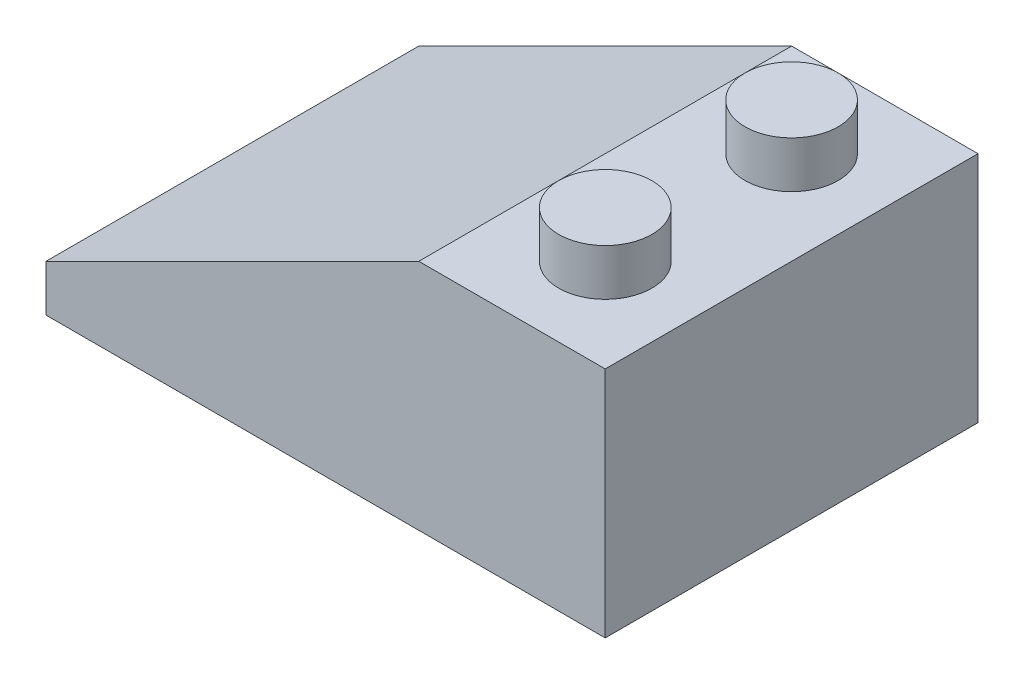
ISO-10303-21;
HEADER;
FILE_DESCRIPTION(('STEP AP214'),'2;1');
FILE_NAME('part.step','',(''),(''),'','','');
FILE_SCHEMA(('AUTOMOTIVE_DESIGN { 1 0 10303 214 1 1 1 1 }'));
ENDSEC;
DATA;
#1=APPLICATION_CONTEXT('core data for automotive mechanical design processes');
#2=APPLICATION_PROTOCOL_DEFINITION('international standard','automotive_design',2000,#1);
#3=PRODUCT_CONTEXT('',#1,'mechanical');
#4=PRODUCT('Part','Part','',(#3));
#5=PRODUCT_RELATED_PRODUCT_CATEGORY('part','',(#4));
#6=PRODUCT_DEFINITION_FORMATION('','',#4);
#7=PRODUCT_DEFINITION_CONTEXT('part definition',#1,'design');
#8=PRODUCT_DEFINITION('design','',#6,#7);
#9=PRODUCT_DEFINITION_SHAPE('','',#8);
#10=(LENGTH_UNIT() NAMED_UNIT(*) SI_UNIT(.MILLI.,.METRE.));
#11=(NAMED_UNIT(*) PLANE_ANGLE_UNIT() SI_UNIT($,.RADIAN.));
#12=(NAMED_UNIT(*) SI_UNIT($,.STERADIAN.) SOLID_ANGLE_UNIT());
#13=UNCERTAINTY_MEASURE_WITH_UNIT(LENGTH_MEASURE(1.E-05),#10,'distance_accuracy_value','');
#14=(GEOMETRIC_REPRESENTATION_CONTEXT(3) GLOBAL_UNCERTAINTY_ASSIGNED_CONTEXT((#13)) GLOBAL_UNIT_ASSIGNED_CONTEXT((#10,
#11,#12)) REPRESENTATION_CONTEXT('',''));
#15=CARTESIAN_POINT('',(0.,0.,0.));
#16=DIRECTION('',(0.,0.,1.));
#17=DIRECTION('',(1.,0.,0.));
#18=AXIS2_PLACEMENT_3D('',#15,#16,#17);
#19=CARTESIAN_POINT('',(0.,0.,-8.));
#20=DIRECTION('',(1.,0.,0.));
#21=DIRECTION('',(0.,0.,-1.));
#22=AXIS2_PLACEMENT_3D('',#19,#20,#21);
#23=PLANE('',#22);
#24=DIRECTION('',(0.,0.,1.));
#25=VECTOR('',#24,1.);
#26=CARTESIAN_POINT('',(0.,10.,-8.));
#27=LINE('',#26,#25);
#28=CARTESIAN_POINT('',(0.,10.,-8.));
#29=VERTEX_POINT('',#28);
#30=CARTESIAN_POINT('',(0.,10.,8.));
#31=VERTEX_POINT('',#30);
#32=EDGE_CURVE('E239',#29,#31,#27,.T.);
#33=ORIENTED_EDGE('',*,*,#32,.T.);
#34=DIRECTION('',(0.,1.,0.));
#35=VECTOR('',#34,1.);
#36=CARTESIAN_POINT('',(0.,0.,8.));
#37=LINE('',#36,#35);
#38=CARTESIAN_POINT('',(0.,0.,8.));
#39=VERTEX_POINT('',#38);
#40=EDGE_CURVE('E207',#39,#31,#37,.T.);
#41=ORIENTED_EDGE('',*,*,#40,.F.);
#42=DIRECTION('',(0.,0.,1.));
#43=VECTOR('',#42,1.);
#44=CARTESIAN_POINT('',(0.,0.,-8.));
#45=LINE('',#44,#43);
#46=CARTESIAN_POINT('',(0.,0.,-8.));
#47=VERTEX_POINT('',#46);
#48=EDGE_CURVE('E52',#47,#39,#45,.T.);
#49=ORIENTED_EDGE('',*,*,#48,.F.);
#50=DIRECTION('',(0.,1.,0.));
#51=VECTOR('',#50,1.);
#52=CARTESIAN_POINT('',(0.,0.,-8.));
#53=LINE('',#52,#51);
#54=EDGE_CURVE('E224',#47,#29,#53,.T.);
#55=ORIENTED_EDGE('',*,*,#54,.T.);
#56=EDGE_LOOP('',(#33,#41,#49,#55));
#57=FACE_BOUND('',#56,.T.);
#58=ADVANCED_FACE('F45',(#57),#23,.T.);
#59=CARTESIAN_POINT('',(0.,0.,-8.));
#60=DIRECTION('',(0.,-1.,0.));
#61=DIRECTION('',(1.,0.,0.));
#62=AXIS2_PLACEMENT_3D('',#59,#60,#61);
#63=PLANE('',#62);
#64=DIRECTION('',(0.,0.,1.));
#65=VECTOR('',#64,1.);
#66=CARTESIAN_POINT('',(-1.,0.,-8.));
#67=LINE('',#66,#65);
#68=CARTESIAN_POINT('',(-1.,0.,-7.));
#69=VERTEX_POINT('',#68);
#70=CARTESIAN_POINT('',(-1.,0.,7.));
#71=VERTEX_POINT('',#70);
#72=EDGE_CURVE('E189',#69,#71,#67,.T.);
#73=ORIENTED_EDGE('',*,*,#72,.F.);
#74=DIRECTION('',(1.,0.,0.));
#75=VECTOR('',#74,1.);
#76=CARTESIAN_POINT('',(0.,0.,-7.));
#77=LINE('',#76,#75);
#78=CARTESIAN_POINT('',(-23.,0.,-7.));
#79=VERTEX_POINT('',#78);
#80=EDGE_CURVE('E150',#79,#69,#77,.T.);
#81=ORIENTED_EDGE('',*,*,#80,.F.);
#82=DIRECTION('',(0.,0.,1.));
#83=VECTOR('',#82,1.);
#84=CARTESIAN_POINT('',(-23.,0.,-8.));
#85=LINE('',#84,#83);
#86=CARTESIAN_POINT('',(-23.,0.,7.));
#87=VERTEX_POINT('',#86);
#88=EDGE_CURVE('E176',#79,#87,#85,.T.);
#89=ORIENTED_EDGE('',*,*,#88,.T.);
#90=DIRECTION('',(1.,0.,0.));
#91=VECTOR('',#90,1.);
#92=CARTESIAN_POINT('',(0.,0.,7.));
#93=LINE('',#92,#91);
#94=EDGE_CURVE('E160',#87,#71,#93,.T.);
#95=ORIENTED_EDGE('',*,*,#94,.T.);
#96=EDGE_LOOP('',(#73,#81,#89,#95));
#97=FACE_BOUND('',#96,.T.);
#98=ORIENTED_EDGE('',*,*,#48,.T.);
#99=DIRECTION('',(1.,0.,0.));
#100=VECTOR('',#99,1.);
#101=CARTESIAN_POINT('',(0.,0.,8.));
#102=LINE('',#101,#100);
#103=CARTESIAN_POINT('',(-24.,0.,8.));
#104=VERTEX_POINT('',#103);
#105=EDGE_CURVE('E221',#104,#39,#102,.T.);
#106=ORIENTED_EDGE('',*,*,#105,.F.);
#107=DIRECTION('',(0.,0.,1.));
#108=VECTOR('',#107,1.);
#109=CARTESIAN_POINT('',(-24.,0.,-8.));
#110=LINE('',#109,#108);
#111=CARTESIAN_POINT('',(-24.,0.,-8.));
#112=VERTEX_POINT('',#111);
#113=EDGE_CURVE('E241',#112,#104,#110,.T.);
#114=ORIENTED_EDGE('',*,*,#113,.F.);
#115=DIRECTION('',(1.,0.,0.));
#116=VECTOR('',#115,1.);
#117=CARTESIAN_POINT('',(0.,0.,-8.));
#118=LINE('',#117,#116);
#119=EDGE_CURVE('E236',#112,#47,#118,.T.);
#120=ORIENTED_EDGE('',*,*,#119,.T.);
#121=EDGE_LOOP('',(#98,#106,#114,#120));
#122=FACE_BOUND('',#121,.T.);
#123=ADVANCED_FACE('F259',(#97,#122),#63,.T.);
#124=CARTESIAN_POINT('',(-24.,0.,-8.));
#125=DIRECTION('',(-1.,0.,0.));
#126=DIRECTION('',(0.,-1.,0.));
#127=AXIS2_PLACEMENT_3D('',#124,#125,#126);
#128=PLANE('',#127);
#129=ORIENTED_EDGE('',*,*,#113,.T.);
#130=DIRECTION('',(0.,-1.,0.));
#131=VECTOR('',#130,1.);
#132=CARTESIAN_POINT('',(-24.,0.,8.));
#133=LINE('',#132,#131);
#134=CARTESIAN_POINT('',(-24.,2.,8.));
#135=VERTEX_POINT('',#134);
#136=EDGE_CURVE('E218',#135,#104,#133,.T.);
#137=ORIENTED_EDGE('',*,*,#136,.F.);
#138=DIRECTION('',(0.,0.,1.));
#139=VECTOR('',#138,1.);
#140=CARTESIAN_POINT('',(-24.,2.,-8.));
#141=LINE('',#140,#139);
#142=CARTESIAN_POINT('',(-24.,2.,-8.));
#143=VERTEX_POINT('',#142);
#144=EDGE_CURVE('E243',#143,#135,#141,.T.);
#145=ORIENTED_EDGE('',*,*,#144,.F.);
#146=DIRECTION('',(0.,-1.,0.));
#147=VECTOR('',#146,1.);
#148=CARTESIAN_POINT('',(-24.,0.,-8.));
#149=LINE('',#148,#147);
#150=EDGE_CURVE('E233',#143,#112,#149,.T.);
#151=ORIENTED_EDGE('',*,*,#150,.T.);
#152=EDGE_LOOP('',(#129,#137,#145,#151));
#153=FACE_BOUND('',#152,.T.);
#154=ADVANCED_FACE('F268',(#153),#128,.T.);
#155=CARTESIAN_POINT('',(-24.,2.,-8.));
#156=DIRECTION('',(-0.447213595499958,0.894427190999916,0.));
#157=DIRECTION('',(-0.894427190999916,-0.447213595499958,0.));
#158=AXIS2_PLACEMENT_3D('',#155,#156,#157);
#159=PLANE('',#158);
#160=ORIENTED_EDGE('',*,*,#144,.T.);
#161=DIRECTION('',(-0.894427190999916,-0.447213595499958,0.));
#162=VECTOR('',#161,1.);
#163=CARTESIAN_POINT('',(-24.,2.,8.));
#164=LINE('',#163,#162);
#165=CARTESIAN_POINT('',(-8.,10.,8.));
#166=VERTEX_POINT('',#165);
#167=EDGE_CURVE('E215',#166,#135,#164,.T.);
#168=ORIENTED_EDGE('',*,*,#167,.F.);
#169=DIRECTION('',(0.,0.,1.));
#170=VECTOR('',#169,1.);
#171=CARTESIAN_POINT('',(-8.,10.,-8.));
#172=LINE('',#171,#170);
#173=CARTESIAN_POINT('',(-8.,10.,-8.));
#174=VERTEX_POINT('',#173);
#175=EDGE_CURVE('E245',#174,#166,#172,.T.);
#176=ORIENTED_EDGE('',*,*,#175,.F.);
#177=DIRECTION('',(-0.894427190999916,-0.447213595499958,0.));
#178=VECTOR('',#177,1.);
#179=CARTESIAN_POINT('',(-24.,2.,-8.));
#180=LINE('',#179,#178);
#181=EDGE_CURVE('E230',#174,#143,#180,.T.);
#182=ORIENTED_EDGE('',*,*,#181,.T.);
#183=EDGE_LOOP('',(#160,#168,#176,#182));
#184=FACE_BOUND('',#183,.T.);
#185=ADVANCED_FACE('F266',(#184),#159,.T.);
#186=CARTESIAN_POINT('',(0.,10.,-8.));
#187=DIRECTION('',(0.,1.,0.));
#188=DIRECTION('',(-1.,0.,0.));
#189=AXIS2_PLACEMENT_3D('',#186,#187,#188);
#190=PLANE('',#189);
#191=CARTESIAN_POINT('',(-4.,10.,-4.));
#192=DIRECTION('',(0.,1.,0.));
#193=DIRECTION('',(-1.,0.,0.));
#194=AXIS2_PLACEMENT_3D('',#191,#192,#193);
#195=CIRCLE('',#194,2.);
#196=CARTESIAN_POINT('',(-6.,10.,-4.));
#197=VERTEX_POINT('',#196);
#198=EDGE_CURVE('E191',#197,#197,#195,.T.);
#199=ORIENTED_EDGE('',*,*,#198,.F.);
#200=EDGE_LOOP('',(#199));
#201=FACE_BOUND('',#200,.T.);
#202=CARTESIAN_POINT('',(-3.99636904074896,10.,4.));
#203=DIRECTION('',(0.,1.,0.));
#204=DIRECTION('',(-1.,0.,0.));
#205=AXIS2_PLACEMENT_3D('',#202,#203,#204);
#206=CIRCLE('',#205,2.);
#207=CARTESIAN_POINT('',(-5.99636904074896,10.,4.));
#208=VERTEX_POINT('',#207);
#209=EDGE_CURVE('E201',#208,#208,#206,.T.);
#210=ORIENTED_EDGE('',*,*,#209,.F.);
#211=EDGE_LOOP('',(#210));
#212=FACE_BOUND('',#211,.T.);
#213=ORIENTED_EDGE('',*,*,#175,.T.);
#214=DIRECTION('',(-1.,0.,0.));
#215=VECTOR('',#214,1.);
#216=CARTESIAN_POINT('',(0.,10.,8.));
#217=LINE('',#216,#215);
#218=EDGE_CURVE('E212',#31,#166,#217,.T.);
#219=ORIENTED_EDGE('',*,*,#218,.F.);
#220=ORIENTED_EDGE('',*,*,#32,.F.);
#221=DIRECTION('',(-1.,0.,0.));
#222=VECTOR('',#221,1.);
#223=CARTESIAN_POINT('',(0.,10.,-8.));
#224=LINE('',#223,#222);
#225=EDGE_CURVE('E227',#29,#174,#224,.T.);
#226=ORIENTED_EDGE('',*,*,#225,.T.);
#227=EDGE_LOOP('',(#213,#219,#220,#226));
#228=FACE_BOUND('',#227,.T.);
#229=ADVANCED_FACE('F252',(#201,#212,#228),#190,.T.);
#230=CARTESIAN_POINT('',(0.,0.,-8.));
#231=DIRECTION('',(0.,0.,1.));
#232=DIRECTION('',(1.,0.,0.));
#233=AXIS2_PLACEMENT_3D('',#230,#231,#232);
#234=PLANE('',#233);
#235=ORIENTED_EDGE('',*,*,#54,.F.);
#236=ORIENTED_EDGE('',*,*,#119,.F.);
#237=ORIENTED_EDGE('',*,*,#150,.F.);
#238=ORIENTED_EDGE('',*,*,#181,.F.);
#239=ORIENTED_EDGE('',*,*,#225,.F.);
#240=EDGE_LOOP('',(#235,#236,#237,#238,#239));
#241=FACE_BOUND('',#240,.T.);
#242=ADVANCED_FACE('F262',(#241),#234,.F.);
#243=CARTESIAN_POINT('',(0.,0.,8.));
#244=DIRECTION('',(0.,0.,1.));
#245=DIRECTION('',(1.,0.,0.));
#246=AXIS2_PLACEMENT_3D('',#243,#244,#245);
#247=PLANE('',#246);
#248=ORIENTED_EDGE('',*,*,#40,.T.);
#249=ORIENTED_EDGE('',*,*,#218,.T.);
#250=ORIENTED_EDGE('',*,*,#167,.T.);
#251=ORIENTED_EDGE('',*,*,#136,.T.);
#252=ORIENTED_EDGE('',*,*,#105,.T.);
#253=EDGE_LOOP('',(#248,#249,#250,#251,#252));
#254=FACE_BOUND('',#253,.T.);
#255=ADVANCED_FACE('F255',(#254),#247,.T.);
#256=CARTESIAN_POINT('',(-3.99636904074896,12.,4.));
#257=DIRECTION('',(0.,-1.,0.));
#258=DIRECTION('',(1.,0.,0.));
#259=AXIS2_PLACEMENT_3D('',#256,#257,#258);
#260=CYLINDRICAL_SURFACE('',#259,2.);
#261=CARTESIAN_POINT('',(-3.99636904074896,12.,4.));
#262=DIRECTION('',(0.,1.,0.));
#263=DIRECTION('',(-1.,0.,0.));
#264=AXIS2_PLACEMENT_3D('',#261,#262,#263);
#265=CIRCLE('',#264,2.);
#266=CARTESIAN_POINT('',(-5.99636904074896,12.,4.));
#267=VERTEX_POINT('',#266);
#268=EDGE_CURVE('E204',#267,#267,#265,.T.);
#269=ORIENTED_EDGE('',*,*,#268,.F.);
#270=EDGE_LOOP('',(#269));
#271=FACE_BOUND('',#270,.T.);
#272=ORIENTED_EDGE('',*,*,#209,.T.);
#273=EDGE_LOOP('',(#272));
#274=FACE_BOUND('',#273,.T.);
#275=ADVANCED_FACE('F489',(#271,#274),#260,.T.);
#276=CARTESIAN_POINT('',(-3.99636904074896,12.,4.));
#277=DIRECTION('',(0.,1.,0.));
#278=DIRECTION('',(-1.,0.,0.));
#279=AXIS2_PLACEMENT_3D('',#276,#277,#278);
#280=PLANE('',#279);
#281=ORIENTED_EDGE('',*,*,#268,.T.);
#282=EDGE_LOOP('',(#281));
#283=FACE_BOUND('',#282,.T.);
#284=ADVANCED_FACE('F485',(#283),#280,.T.);
#285=CARTESIAN_POINT('',(-4.,12.,-4.));
#286=DIRECTION('',(0.,-1.,0.));
#287=DIRECTION('',(1.,0.,0.));
#288=AXIS2_PLACEMENT_3D('',#285,#286,#287);
#289=CYLINDRICAL_SURFACE('',#288,2.);
#290=CARTESIAN_POINT('',(-4.,12.,-4.));
#291=DIRECTION('',(0.,1.,0.));
#292=DIRECTION('',(-1.,0.,0.));
#293=AXIS2_PLACEMENT_3D('',#290,#291,#292);
#294=CIRCLE('',#293,2.);
#295=CARTESIAN_POINT('',(-6.,12.,-4.));
#296=VERTEX_POINT('',#295);
#297=EDGE_CURVE('E198',#296,#296,#294,.T.);
#298=ORIENTED_EDGE('',*,*,#297,.F.);
#299=EDGE_LOOP('',(#298));
#300=FACE_BOUND('',#299,.T.);
#301=ORIENTED_EDGE('',*,*,#198,.T.);
#302=EDGE_LOOP('',(#301));
#303=FACE_BOUND('',#302,.T.);
#304=ADVANCED_FACE('F481',(#300,#303),#289,.T.);
#305=CARTESIAN_POINT('',(-4.,12.,-4.));
#306=DIRECTION('',(0.,1.,0.));
#307=DIRECTION('',(-1.,0.,0.));
#308=AXIS2_PLACEMENT_3D('',#305,#306,#307);
#309=PLANE('',#308);
#310=ORIENTED_EDGE('',*,*,#297,.T.);
#311=EDGE_LOOP('',(#310));
#312=FACE_BOUND('',#311,.T.);
#313=ADVANCED_FACE('F292',(#312),#309,.T.);
#314=CARTESIAN_POINT('',(-1.,0.,-8.));
#315=DIRECTION('',(1.,0.,0.));
#316=DIRECTION('',(0.,0.,-1.));
#317=AXIS2_PLACEMENT_3D('',#314,#315,#316);
#318=PLANE('',#317);
#319=DIRECTION('',(0.,0.,1.));
#320=VECTOR('',#319,1.);
#321=CARTESIAN_POINT('',(-1.,9.,-8.));
#322=LINE('',#321,#320);
#323=CARTESIAN_POINT('',(-1.,9.,-7.));
#324=VERTEX_POINT('',#323);
#325=CARTESIAN_POINT('',(-1.,9.,7.));
#326=VERTEX_POINT('',#325);
#327=EDGE_CURVE('E148',#324,#326,#322,.T.);
#328=ORIENTED_EDGE('',*,*,#327,.F.);
#329=DIRECTION('',(0.,1.,0.));
#330=VECTOR('',#329,1.);
#331=CARTESIAN_POINT('',(-1.,0.,-7.));
#332=LINE('',#331,#330);
#333=EDGE_CURVE('E156',#69,#324,#332,.T.);
#334=ORIENTED_EDGE('',*,*,#333,.F.);
#335=ORIENTED_EDGE('',*,*,#72,.T.);
#336=DIRECTION('',(0.,1.,0.));
#337=VECTOR('',#336,1.);
#338=CARTESIAN_POINT('',(-1.,0.,7.));
#339=LINE('',#338,#337);
#340=EDGE_CURVE('E151',#71,#326,#339,.T.);
#341=ORIENTED_EDGE('',*,*,#340,.T.);
#342=EDGE_LOOP('',(#328,#334,#335,#341));
#343=FACE_BOUND('',#342,.T.);
#344=ADVANCED_FACE('F297',(#343),#318,.F.);
#345=CARTESIAN_POINT('',(-23.,0.,-8.));
#346=DIRECTION('',(-1.,0.,0.));
#347=DIRECTION('',(0.,-1.,0.));
#348=AXIS2_PLACEMENT_3D('',#345,#346,#347);
#349=PLANE('',#348);
#350=ORIENTED_EDGE('',*,*,#88,.F.);
#351=DIRECTION('',(0.,-1.,0.));
#352=VECTOR('',#351,1.);
#353=CARTESIAN_POINT('',(-23.,2.393918396848E-13,-7.));
#354=LINE('',#353,#352);
#355=CARTESIAN_POINT('',(-23.,1.3819660112501,-7.));
#356=VERTEX_POINT('',#355);
#357=EDGE_CURVE('E182',#356,#79,#354,.T.);
#358=ORIENTED_EDGE('',*,*,#357,.F.);
#359=DIRECTION('',(0.,0.,1.));
#360=VECTOR('',#359,1.);
#361=CARTESIAN_POINT('',(-23.,1.3819660112501,-8.));
#362=LINE('',#361,#360);
#363=CARTESIAN_POINT('',(-23.,1.3819660112501,7.));
#364=VERTEX_POINT('',#363);
#365=EDGE_CURVE('E168',#356,#364,#362,.T.);
#366=ORIENTED_EDGE('',*,*,#365,.T.);
#367=DIRECTION('',(0.,-1.,0.));
#368=VECTOR('',#367,1.);
#369=CARTESIAN_POINT('',(-23.,2.393918396848E-13,7.));
#370=LINE('',#369,#368);
#371=EDGE_CURVE('E179',#364,#87,#370,.T.);
#372=ORIENTED_EDGE('',*,*,#371,.T.);
#373=EDGE_LOOP('',(#350,#358,#366,#372));
#374=FACE_BOUND('',#373,.T.);
#375=ADVANCED_FACE('F302',(#374),#349,.F.);
#376=CARTESIAN_POINT('',(-23.5527864045,1.10557280900008,-8.));
#377=DIRECTION('',(-0.447213595499958,0.894427190999916,0.));
#378=DIRECTION('',(-0.894427190999916,-0.447213595499958,0.));
#379=AXIS2_PLACEMENT_3D('',#376,#377,#378);
#380=PLANE('',#379);
#381=CARTESIAN_POINT('',(-16.,4.88196601128266,0.));
#382=DIRECTION('',(-0.447213595499958,0.894427190999916,0.));
#383=DIRECTION('',(-0.894427190999916,-0.447213595499958,0.));
#384=AXIS2_PLACEMENT_3D('',#381,#382,#383);
#385=ELLIPSE('',#384,3.01869176962472,2.7);
#386=CARTESIAN_POINT('',(-18.7,3.53196601128266,0.));
#387=VERTEX_POINT('',#386);
#388=EDGE_CURVE('E557',#387,#387,#385,.F.);
#389=ORIENTED_EDGE('',*,*,#388,.F.);
#390=EDGE_LOOP('',(#389));
#391=FACE_BOUND('',#390,.T.);
#392=DIRECTION('',(0.,0.,1.));
#393=VECTOR('',#392,1.);
#394=CARTESIAN_POINT('',(-7.76393202250021,9.,-8.));
#395=LINE('',#394,#393);
#396=CARTESIAN_POINT('',(-7.76393202250021,9.,-7.));
#397=VERTEX_POINT('',#396);
#398=CARTESIAN_POINT('',(-7.76393202250021,9.00000000001455,-2.68966018485592));
#399=VERTEX_POINT('',#398);
#400=EDGE_CURVE('E135',#397,#399,#395,.T.);
#401=ORIENTED_EDGE('',*,*,#400,.T.);
#402=CARTESIAN_POINT('',(-8.,8.88196601130176,0.));
#403=DIRECTION('',(-0.447213595499958,0.894427190999916,0.));
#404=DIRECTION('',(-0.894427190999916,-0.447213595499958,0.));
#405=AXIS2_PLACEMENT_3D('',#402,#403,#404);
#406=ELLIPSE('',#405,3.01869176962472,2.7);
#407=CARTESIAN_POINT('',(-7.76393202250021,9.,2.68966018485773));
#408=VERTEX_POINT('',#407);
#409=EDGE_CURVE('E65',#408,#399,#406,.F.);
#410=ORIENTED_EDGE('',*,*,#409,.F.);
#411=CARTESIAN_POINT('',(-7.76393202250021,9.,7.));
#412=VERTEX_POINT('',#411);
#413=EDGE_CURVE('E136',#408,#412,#395,.T.);
#414=ORIENTED_EDGE('',*,*,#413,.T.);
#415=DIRECTION('',(-0.894427190999916,-0.447213595499958,0.));
#416=VECTOR('',#415,1.);
#417=CARTESIAN_POINT('',(-5.15278640450004,10.3055728090001,7.));
#418=LINE('',#417,#416);
#419=EDGE_CURVE('E171',#412,#364,#418,.T.);
#420=ORIENTED_EDGE('',*,*,#419,.T.);
#421=ORIENTED_EDGE('',*,*,#365,.F.);
#422=DIRECTION('',(-0.894427190999916,-0.447213595499958,0.));
#423=VECTOR('',#422,1.);
#424=CARTESIAN_POINT('',(-5.15278640450004,10.3055728090001,-7.));
#425=LINE('',#424,#423);
#426=EDGE_CURVE('E174',#397,#356,#425,.T.);
#427=ORIENTED_EDGE('',*,*,#426,.F.);
#428=EDGE_LOOP('',(#401,#410,#414,#420,#421,#427));
#429=FACE_BOUND('',#428,.T.);
#430=ADVANCED_FACE('F312',(#391,#429),#380,.F.);
#431=CARTESIAN_POINT('',(0.,9.,-8.));
#432=DIRECTION('',(0.,1.,0.));
#433=DIRECTION('',(-1.,0.,0.));
#434=AXIS2_PLACEMENT_3D('',#431,#432,#433);
#435=PLANE('',#434);
#436=CARTESIAN_POINT('',(-4.,9.,-4.));
#437=DIRECTION('',(0.,1.,0.));
#438=DIRECTION('',(-1.,0.,0.));
#439=AXIS2_PLACEMENT_3D('',#436,#437,#438);
#440=CIRCLE('',#439,1.);
#441=CARTESIAN_POINT('',(-5.,9.,-4.));
#442=VERTEX_POINT('',#441);
#443=EDGE_CURVE('E141',#442,#442,#440,.T.);
#444=ORIENTED_EDGE('',*,*,#443,.T.);
#445=EDGE_LOOP('',(#444));
#446=FACE_BOUND('',#445,.T.);
#447=CARTESIAN_POINT('',(-3.99636904074896,9.,4.));
#448=DIRECTION('',(0.,1.,0.));
#449=DIRECTION('',(-1.,0.,0.));
#450=AXIS2_PLACEMENT_3D('',#447,#448,#449);
#451=CIRCLE('',#450,1.);
#452=CARTESIAN_POINT('',(-4.99636904074896,9.,4.));
#453=VERTEX_POINT('',#452);
#454=EDGE_CURVE('E164',#453,#453,#451,.T.);
#455=ORIENTED_EDGE('',*,*,#454,.T.);
#456=EDGE_LOOP('',(#455));
#457=FACE_BOUND('',#456,.T.);
#458=ORIENTED_EDGE('',*,*,#413,.F.);
#459=CARTESIAN_POINT('',(-8.,9.00000000001455,0.));
#460=DIRECTION('',(0.,1.,0.));
#461=DIRECTION('',(-1.,0.,0.));
#462=AXIS2_PLACEMENT_3D('',#459,#460,#461);
#463=CIRCLE('',#462,2.7);
#464=EDGE_CURVE('E144',#399,#408,#463,.F.);
#465=ORIENTED_EDGE('',*,*,#464,.F.);
#466=ORIENTED_EDGE('',*,*,#400,.F.);
#467=DIRECTION('',(-1.,0.,0.));
#468=VECTOR('',#467,1.);
#469=CARTESIAN_POINT('',(0.,9.,-7.));
#470=LINE('',#469,#468);
#471=EDGE_CURVE('E159',#324,#397,#470,.T.);
#472=ORIENTED_EDGE('',*,*,#471,.F.);
#473=ORIENTED_EDGE('',*,*,#327,.T.);
#474=DIRECTION('',(-1.,0.,0.));
#475=VECTOR('',#474,1.);
#476=CARTESIAN_POINT('',(0.,9.,7.));
#477=LINE('',#476,#475);
#478=EDGE_CURVE('E154',#326,#412,#477,.T.);
#479=ORIENTED_EDGE('',*,*,#478,.T.);
#480=EDGE_LOOP('',(#458,#465,#466,#472,#473,#479));
#481=FACE_BOUND('',#480,.T.);
#482=ADVANCED_FACE('F326',(#446,#457,#481),#435,.F.);
#483=CARTESIAN_POINT('',(0.,0.,-7.));
#484=DIRECTION('',(0.,0.,1.));
#485=DIRECTION('',(1.,0.,0.));
#486=AXIS2_PLACEMENT_3D('',#483,#484,#485);
#487=PLANE('',#486);
#488=ORIENTED_EDGE('',*,*,#333,.T.);
#489=ORIENTED_EDGE('',*,*,#471,.T.);
#490=ORIENTED_EDGE('',*,*,#426,.T.);
#491=ORIENTED_EDGE('',*,*,#357,.T.);
#492=ORIENTED_EDGE('',*,*,#80,.T.);
#493=EDGE_LOOP('',(#488,#489,#490,#491,#492));
#494=FACE_BOUND('',#493,.T.);
#495=ADVANCED_FACE('F320',(#494),#487,.T.);
#496=CARTESIAN_POINT('',(0.,0.,7.));
#497=DIRECTION('',(0.,0.,1.));
#498=DIRECTION('',(1.,0.,0.));
#499=AXIS2_PLACEMENT_3D('',#496,#497,#498);
#500=PLANE('',#499);
#501=ORIENTED_EDGE('',*,*,#340,.F.);
#502=ORIENTED_EDGE('',*,*,#94,.F.);
#503=ORIENTED_EDGE('',*,*,#371,.F.);
#504=ORIENTED_EDGE('',*,*,#419,.F.);
#505=ORIENTED_EDGE('',*,*,#478,.F.);
#506=EDGE_LOOP('',(#501,#502,#503,#504,#505));
#507=FACE_BOUND('',#506,.T.);
#508=ADVANCED_FACE('F325',(#507),#500,.F.);
#509=CARTESIAN_POINT('',(-3.99636904074896,12.,4.));
#510=DIRECTION('',(0.,-1.,0.));
#511=DIRECTION('',(1.,0.,0.));
#512=AXIS2_PLACEMENT_3D('',#509,#510,#511);
#513=CYLINDRICAL_SURFACE('',#512,1.);
#514=CARTESIAN_POINT('',(-3.99636904074896,11.,4.));
#515=DIRECTION('',(0.,1.,0.));
#516=DIRECTION('',(-1.,0.,0.));
#517=AXIS2_PLACEMENT_3D('',#514,#515,#516);
#518=CIRCLE('',#517,1.);
#519=CARTESIAN_POINT('',(-4.99636904074896,11.,4.));
#520=VERTEX_POINT('',#519);
#521=EDGE_CURVE('E155',#520,#520,#518,.T.);
#522=ORIENTED_EDGE('',*,*,#521,.T.);
#523=EDGE_LOOP('',(#522));
#524=FACE_BOUND('',#523,.T.);
#525=ORIENTED_EDGE('',*,*,#454,.F.);
#526=EDGE_LOOP('',(#525));
#527=FACE_BOUND('',#526,.T.);
#528=ADVANCED_FACE('F338',(#524,#527),#513,.F.);
#529=CARTESIAN_POINT('',(-3.99636904074896,11.,4.));
#530=DIRECTION('',(0.,1.,0.));
#531=DIRECTION('',(-1.,0.,0.));
#532=AXIS2_PLACEMENT_3D('',#529,#530,#531);
#533=PLANE('',#532);
#534=ORIENTED_EDGE('',*,*,#521,.F.);
#535=EDGE_LOOP('',(#534));
#536=FACE_BOUND('',#535,.T.);
#537=ADVANCED_FACE('F348',(#536),#533,.F.);
#538=CARTESIAN_POINT('',(-4.,12.,-4.));
#539=DIRECTION('',(0.,-1.,0.));
#540=DIRECTION('',(1.,0.,0.));
#541=AXIS2_PLACEMENT_3D('',#538,#539,#540);
#542=CYLINDRICAL_SURFACE('',#541,1.);
#543=CARTESIAN_POINT('',(-4.,11.,-4.));
#544=DIRECTION('',(0.,1.,0.));
#545=DIRECTION('',(-1.,0.,0.));
#546=AXIS2_PLACEMENT_3D('',#543,#544,#545);
#547=CIRCLE('',#546,1.);
#548=CARTESIAN_POINT('',(-5.,11.,-4.));
#549=VERTEX_POINT('',#548);
#550=EDGE_CURVE('E163',#549,#549,#547,.T.);
#551=ORIENTED_EDGE('',*,*,#550,.T.);
#552=EDGE_LOOP('',(#551));
#553=FACE_BOUND('',#552,.T.);
#554=ORIENTED_EDGE('',*,*,#443,.F.);
#555=EDGE_LOOP('',(#554));
#556=FACE_BOUND('',#555,.T.);
#557=ADVANCED_FACE('F358',(#553,#556),#542,.F.);
#558=CARTESIAN_POINT('',(-4.,11.,-4.));
#559=DIRECTION('',(0.,1.,0.));
#560=DIRECTION('',(-1.,0.,0.));
#561=AXIS2_PLACEMENT_3D('',#558,#559,#560);
#562=PLANE('',#561);
#563=ORIENTED_EDGE('',*,*,#550,.F.);
#564=EDGE_LOOP('',(#563));
#565=FACE_BOUND('',#564,.T.);
#566=ADVANCED_FACE('F368',(#565),#562,.F.);
#567=CARTESIAN_POINT('',(-8.,0.,0.));
#568=DIRECTION('',(0.,-1.,0.));
#569=DIRECTION('',(1.,0.,0.));
#570=AXIS2_PLACEMENT_3D('',#567,#568,#569);
#571=PLANE('',#570);
#572=CARTESIAN_POINT('',(-8.,0.,0.));
#573=DIRECTION('',(0.,-1.,0.));
#574=DIRECTION('',(1.,0.,0.));
#575=AXIS2_PLACEMENT_3D('',#572,#573,#574);
#576=CIRCLE('',#575,1.7);
#577=CARTESIAN_POINT('',(-6.3,0.,0.));
#578=VERTEX_POINT('',#577);
#579=EDGE_CURVE('E566',#578,#578,#576,.T.);
#580=ORIENTED_EDGE('',*,*,#579,.F.);
#581=EDGE_LOOP('',(#580));
#582=FACE_BOUND('',#581,.T.);
#583=CARTESIAN_POINT('',(-8.,0.,0.));
#584=DIRECTION('',(0.,-1.,0.));
#585=DIRECTION('',(1.,0.,0.));
#586=AXIS2_PLACEMENT_3D('',#583,#584,#585);
#587=CIRCLE('',#586,2.7);
#588=CARTESIAN_POINT('',(-5.3,0.,0.));
#589=VERTEX_POINT('',#588);
#590=EDGE_CURVE('E561',#589,#589,#587,.T.);
#591=ORIENTED_EDGE('',*,*,#590,.T.);
#592=EDGE_LOOP('',(#591));
#593=FACE_BOUND('',#592,.T.);
#594=ADVANCED_FACE('F378',(#582,#593),#571,.T.);
#595=CARTESIAN_POINT('',(-8.00000000006123,500000.,0.));
#596=DIRECTION('',(0.,-1.,0.));
#597=DIRECTION('',(1.,0.,0.));
#598=AXIS2_PLACEMENT_3D('',#595,#596,#597);
#599=CYLINDRICAL_SURFACE('',#598,2.7);
#600=ORIENTED_EDGE('',*,*,#590,.F.);
#601=EDGE_LOOP('',(#600));
#602=FACE_BOUND('',#601,.T.);
#603=ORIENTED_EDGE('',*,*,#409,.T.);
#604=ORIENTED_EDGE('',*,*,#464,.T.);
#605=EDGE_LOOP('',(#603,#604));
#606=FACE_BOUND('',#605,.T.);
#607=ADVANCED_FACE('F404',(#602,#606),#599,.T.);
#608=CARTESIAN_POINT('',(-8.00000000006123,500000.,0.));
#609=DIRECTION('',(0.,-1.,0.));
#610=DIRECTION('',(1.,0.,0.));
#611=AXIS2_PLACEMENT_3D('',#608,#609,#610);
#612=CYLINDRICAL_SURFACE('',#611,1.7);
#613=ORIENTED_EDGE('',*,*,#579,.T.);
#614=EDGE_LOOP('',(#613));
#615=FACE_BOUND('',#614,.T.);
#616=CARTESIAN_POINT('',(-8.,9.00000000001455,0.));
#617=DIRECTION('',(0.,1.,0.));
#618=DIRECTION('',(-1.,0.,0.));
#619=AXIS2_PLACEMENT_3D('',#616,#617,#618);
#620=CIRCLE('',#619,1.7);
#621=CARTESIAN_POINT('',(-7.76393202250021,9.,-1.68352959879205));
#622=VERTEX_POINT('',#621);
#623=CARTESIAN_POINT('',(-7.76393202250021,9.00000000001455,1.68352959878915));
#624=VERTEX_POINT('',#623);
#625=EDGE_CURVE('E58',#622,#624,#620,.F.);
#626=ORIENTED_EDGE('',*,*,#625,.F.);
#627=CARTESIAN_POINT('',(-8.,8.88196601130176,0.));
#628=DIRECTION('',(-0.447213595499958,0.894427190999916,0.));
#629=DIRECTION('',(-0.894427190999916,-0.447213595499958,0.));
#630=AXIS2_PLACEMENT_3D('',#627,#628,#629);
#631=ELLIPSE('',#630,1.90065778087482,1.7);
#632=EDGE_CURVE('E138',#624,#622,#631,.F.);
#633=ORIENTED_EDGE('',*,*,#632,.F.);
#634=EDGE_LOOP('',(#626,#633));
#635=FACE_BOUND('',#634,.T.);
#636=ADVANCED_FACE('F143',(#615,#635),#612,.F.);
#637=ORIENTED_EDGE('',*,*,#625,.T.);
#638=EDGE_CURVE('E130',#622,#624,#395,.T.);
#639=ORIENTED_EDGE('',*,*,#638,.F.);
#640=EDGE_LOOP('',(#637,#639));
#641=FACE_BOUND('',#640,.T.);
#642=ADVANCED_FACE('F132',(#641),#435,.F.);
#643=ORIENTED_EDGE('',*,*,#632,.T.);
#644=ORIENTED_EDGE('',*,*,#638,.T.);
#645=EDGE_LOOP('',(#643,#644));
#646=FACE_BOUND('',#645,.T.);
#647=ADVANCED_FACE('F139',(#646),#380,.F.);
#648=CARTESIAN_POINT('',(-16.,0.,0.));
#649=DIRECTION('',(0.,1.,0.));
#650=DIRECTION('',(-1.,0.,0.));
#651=AXIS2_PLACEMENT_3D('',#648,#649,#650);
#652=PLANE('',#651);
#653=CARTESIAN_POINT('',(-16.,0.,0.));
#654=DIRECTION('',(0.,-1.,0.));
#655=DIRECTION('',(-1.,0.,0.));
#656=AXIS2_PLACEMENT_3D('',#653,#654,#655);
#657=CIRCLE('',#656,1.7);
#658=CARTESIAN_POINT('',(-17.7,0.,0.));
#659=VERTEX_POINT('',#658);
#660=EDGE_CURVE('E556',#659,#659,#657,.T.);
#661=ORIENTED_EDGE('',*,*,#660,.F.);
#662=EDGE_LOOP('',(#661));
#663=FACE_BOUND('',#662,.T.);
#664=CARTESIAN_POINT('',(-16.,0.,0.));
#665=DIRECTION('',(0.,-1.,0.));
#666=DIRECTION('',(-1.,0.,0.));
#667=AXIS2_PLACEMENT_3D('',#664,#665,#666);
#668=CIRCLE('',#667,2.7);
#669=CARTESIAN_POINT('',(-18.7,0.,0.));
#670=VERTEX_POINT('',#669);
#671=EDGE_CURVE('E558',#670,#670,#668,.T.);
#672=ORIENTED_EDGE('',*,*,#671,.T.);
#673=EDGE_LOOP('',(#672));
#674=FACE_BOUND('',#673,.T.);
#675=ADVANCED_FACE('F440',(#663,#674),#652,.F.);
#676=CARTESIAN_POINT('',(-16.0000000000613,500000.,0.));
#677=DIRECTION('',(0.,-1.,0.));
#678=DIRECTION('',(1.,0.,0.));
#679=AXIS2_PLACEMENT_3D('',#676,#677,#678);
#680=CYLINDRICAL_SURFACE('',#679,2.7);
#681=ORIENTED_EDGE('',*,*,#671,.F.);
#682=EDGE_LOOP('',(#681));
#683=FACE_BOUND('',#682,.T.);
#684=ORIENTED_EDGE('',*,*,#388,.T.);
#685=EDGE_LOOP('',(#684));
#686=FACE_BOUND('',#685,.T.);
#687=ADVANCED_FACE('F448',(#683,#686),#680,.T.);
#688=CARTESIAN_POINT('',(-16.0000000000613,500000.,0.));
#689=DIRECTION('',(0.,-1.,0.));
#690=DIRECTION('',(1.,0.,0.));
#691=AXIS2_PLACEMENT_3D('',#688,#689,#690);
#692=CYLINDRICAL_SURFACE('',#691,1.7);
#693=ORIENTED_EDGE('',*,*,#660,.T.);
#694=EDGE_LOOP('',(#693));
#695=FACE_BOUND('',#694,.T.);
#696=CARTESIAN_POINT('',(-16.,4.88196601128266,0.));
#697=DIRECTION('',(-0.447213595499958,0.894427190999916,0.));
#698=DIRECTION('',(-0.894427190999916,-0.447213595499958,0.));
#699=AXIS2_PLACEMENT_3D('',#696,#697,#698);
#700=ELLIPSE('',#699,1.90065778087482,1.7);
#701=CARTESIAN_POINT('',(-17.7,4.03196601128266,0.));
#702=VERTEX_POINT('',#701);
#703=EDGE_CURVE('E12',#702,#702,#700,.T.);
#704=ORIENTED_EDGE('',*,*,#703,.T.);
#705=EDGE_LOOP('',(#704));
#706=FACE_BOUND('',#705,.T.);
#707=ADVANCED_FACE('F441',(#695,#706),#692,.F.);
#708=ORIENTED_EDGE('',*,*,#703,.F.);
#709=EDGE_LOOP('',(#708));
#710=FACE_BOUND('',#709,.T.);
#711=ADVANCED_FACE('F390',(#710),#380,.F.);
#712=CLOSED_SHELL('',(#58,#123,#154,#185,#229,#242,#255,#275,#284,#304,#313,#344,#375,#430,#482,
#495,#508,#528,#537,#557,#566,#594,#607,#636,#642,#647,#675,#687,#707,#711));
#713=MANIFOLD_SOLID_BREP('B2',#712);
#714=ADVANCED_BREP_SHAPE_REPRESENTATION('',(#18,#713),#14);
#715=SHAPE_DEFINITION_REPRESENTATION(#9,#714);
ENDSEC;
END-ISO-10303-21;
